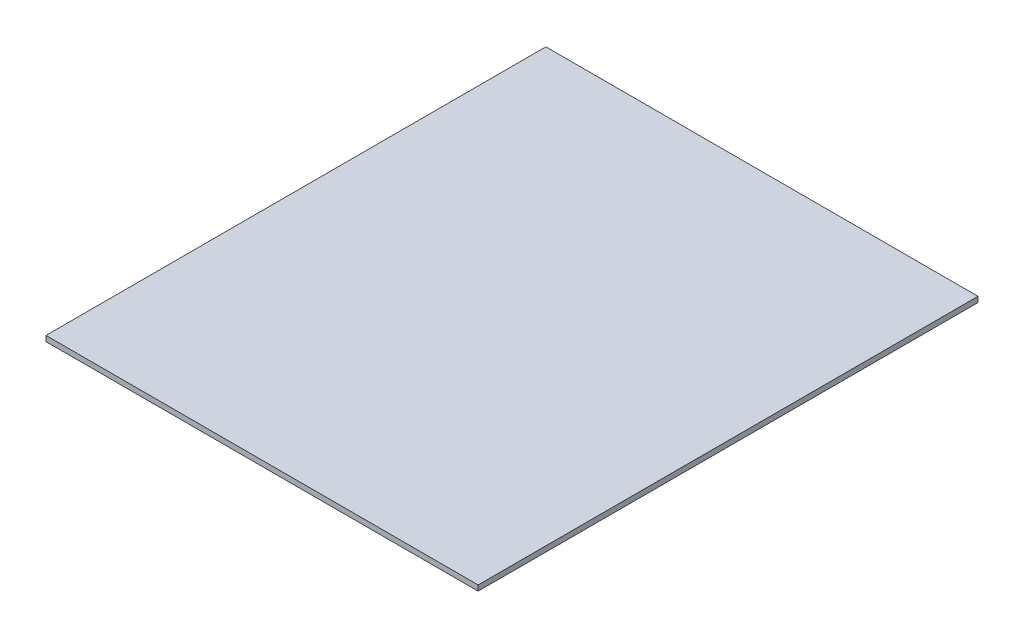
ISO-10303-21;
HEADER;
FILE_DESCRIPTION(('STEP AP214'),'2;1');
FILE_NAME('part.step','',(''),(''),'','','');
FILE_SCHEMA(('AUTOMOTIVE_DESIGN { 1 0 10303 214 1 1 1 1 }'));
ENDSEC;
DATA;
#1=APPLICATION_CONTEXT('core data for automotive mechanical design processes');
#2=APPLICATION_PROTOCOL_DEFINITION('international standard','automotive_design',2000,#1);
#3=PRODUCT_CONTEXT('',#1,'mechanical');
#4=PRODUCT('Part','Part','',(#3));
#5=PRODUCT_RELATED_PRODUCT_CATEGORY('part','',(#4));
#6=PRODUCT_DEFINITION_FORMATION('','',#4);
#7=PRODUCT_DEFINITION_CONTEXT('part definition',#1,'design');
#8=PRODUCT_DEFINITION('design','',#6,#7);
#9=PRODUCT_DEFINITION_SHAPE('','',#8);
#10=(LENGTH_UNIT() NAMED_UNIT(*) SI_UNIT(.MILLI.,.METRE.));
#11=(NAMED_UNIT(*) PLANE_ANGLE_UNIT() SI_UNIT($,.RADIAN.));
#12=(NAMED_UNIT(*) SI_UNIT($,.STERADIAN.) SOLID_ANGLE_UNIT());
#13=UNCERTAINTY_MEASURE_WITH_UNIT(LENGTH_MEASURE(1.E-05),#10,'distance_accuracy_value','');
#14=(GEOMETRIC_REPRESENTATION_CONTEXT(3) GLOBAL_UNCERTAINTY_ASSIGNED_CONTEXT((#13)) GLOBAL_UNIT_ASSIGNED_CONTEXT((#10,
#11,#12)) REPRESENTATION_CONTEXT('',''));
#15=CARTESIAN_POINT('',(0.,0.,0.));
#16=DIRECTION('',(0.,0.,1.));
#17=DIRECTION('',(1.,0.,0.));
#18=AXIS2_PLACEMENT_3D('',#15,#16,#17);
#19=CARTESIAN_POINT('',(253.20625,6.35,292.89375));
#20=DIRECTION('',(-1.,0.,0.));
#21=DIRECTION('',(0.,0.,1.));
#22=AXIS2_PLACEMENT_3D('',#19,#20,#21);
#23=PLANE('',#22);
#24=DIRECTION('',(0.,0.,-1.));
#25=VECTOR('',#24,1.);
#26=CARTESIAN_POINT('',(253.20625,0.,292.89375));
#27=LINE('',#26,#25);
#28=CARTESIAN_POINT('',(253.20625,0.,292.89375));
#29=VERTEX_POINT('',#28);
#30=CARTESIAN_POINT('',(253.20625,0.,-292.89375));
#31=VERTEX_POINT('',#30);
#32=EDGE_CURVE('E111',#29,#31,#27,.T.);
#33=ORIENTED_EDGE('',*,*,#32,.T.);
#34=DIRECTION('',(0.,-1.,0.));
#35=VECTOR('',#34,1.);
#36=CARTESIAN_POINT('',(253.20625,6.35,-292.89375));
#37=LINE('',#36,#35);
#38=CARTESIAN_POINT('',(253.20625,6.35,-292.89375));
#39=VERTEX_POINT('',#38);
#40=EDGE_CURVE('E11',#39,#31,#37,.T.);
#41=ORIENTED_EDGE('',*,*,#40,.F.);
#42=DIRECTION('',(0.,0.,-1.));
#43=VECTOR('',#42,1.);
#44=CARTESIAN_POINT('',(253.20625,6.35,292.89375));
#45=LINE('',#44,#43);
#46=CARTESIAN_POINT('',(253.20625,6.35,292.89375));
#47=VERTEX_POINT('',#46);
#48=EDGE_CURVE('E95',#47,#39,#45,.T.);
#49=ORIENTED_EDGE('',*,*,#48,.F.);
#50=DIRECTION('',(0.,-1.,0.));
#51=VECTOR('',#50,1.);
#52=CARTESIAN_POINT('',(253.20625,6.35,292.89375));
#53=LINE('',#52,#51);
#54=EDGE_CURVE('E107',#47,#29,#53,.T.);
#55=ORIENTED_EDGE('',*,*,#54,.T.);
#56=EDGE_LOOP('',(#33,#41,#49,#55));
#57=FACE_BOUND('',#56,.T.);
#58=ADVANCED_FACE('F43',(#57),#23,.F.);
#59=CARTESIAN_POINT('',(-253.20625,6.35,-292.89375));
#60=DIRECTION('',(0.,0.,1.));
#61=DIRECTION('',(1.,0.,0.));
#62=AXIS2_PLACEMENT_3D('',#59,#60,#61);
#63=PLANE('',#62);
#64=DIRECTION('',(-1.,0.,0.));
#65=VECTOR('',#64,1.);
#66=CARTESIAN_POINT('',(-253.20625,0.,-292.89375));
#67=LINE('',#66,#65);
#68=CARTESIAN_POINT('',(-253.20625,0.,-292.89375));
#69=VERTEX_POINT('',#68);
#70=EDGE_CURVE('E100',#31,#69,#67,.T.);
#71=ORIENTED_EDGE('',*,*,#70,.T.);
#72=DIRECTION('',(0.,-1.,0.));
#73=VECTOR('',#72,1.);
#74=CARTESIAN_POINT('',(-253.20625,6.35,-292.89375));
#75=LINE('',#74,#73);
#76=CARTESIAN_POINT('',(-253.20625,6.35,-292.89375));
#77=VERTEX_POINT('',#76);
#78=EDGE_CURVE('E52',#77,#69,#75,.T.);
#79=ORIENTED_EDGE('',*,*,#78,.F.);
#80=DIRECTION('',(-1.,0.,0.));
#81=VECTOR('',#80,1.);
#82=CARTESIAN_POINT('',(-253.20625,6.35,-292.89375));
#83=LINE('',#82,#81);
#84=EDGE_CURVE('E90',#39,#77,#83,.T.);
#85=ORIENTED_EDGE('',*,*,#84,.F.);
#86=ORIENTED_EDGE('',*,*,#40,.T.);
#87=EDGE_LOOP('',(#71,#79,#85,#86));
#88=FACE_BOUND('',#87,.T.);
#89=ADVANCED_FACE('F99',(#88),#63,.F.);
#90=CARTESIAN_POINT('',(-253.20625,6.35,292.89375));
#91=DIRECTION('',(1.,0.,0.));
#92=DIRECTION('',(0.,0.,-1.));
#93=AXIS2_PLACEMENT_3D('',#90,#91,#92);
#94=PLANE('',#93);
#95=DIRECTION('',(0.,0.,1.));
#96=VECTOR('',#95,1.);
#97=CARTESIAN_POINT('',(-253.20625,0.,292.89375));
#98=LINE('',#97,#96);
#99=CARTESIAN_POINT('',(-253.20625,0.,292.89375));
#100=VERTEX_POINT('',#99);
#101=EDGE_CURVE('E77',#69,#100,#98,.T.);
#102=ORIENTED_EDGE('',*,*,#101,.T.);
#103=DIRECTION('',(0.,-1.,0.));
#104=VECTOR('',#103,1.);
#105=CARTESIAN_POINT('',(-253.20625,6.35,292.89375));
#106=LINE('',#105,#104);
#107=CARTESIAN_POINT('',(-253.20625,6.35,292.89375));
#108=VERTEX_POINT('',#107);
#109=EDGE_CURVE('E102',#108,#100,#106,.T.);
#110=ORIENTED_EDGE('',*,*,#109,.F.);
#111=DIRECTION('',(0.,0.,1.));
#112=VECTOR('',#111,1.);
#113=CARTESIAN_POINT('',(-253.20625,6.35,292.89375));
#114=LINE('',#113,#112);
#115=EDGE_CURVE('E93',#77,#108,#114,.T.);
#116=ORIENTED_EDGE('',*,*,#115,.F.);
#117=ORIENTED_EDGE('',*,*,#78,.T.);
#118=EDGE_LOOP('',(#102,#110,#116,#117));
#119=FACE_BOUND('',#118,.T.);
#120=ADVANCED_FACE('F103',(#119),#94,.F.);
#121=CARTESIAN_POINT('',(-253.20625,6.35,292.89375));
#122=DIRECTION('',(0.,0.,-1.));
#123=DIRECTION('',(-1.,0.,0.));
#124=AXIS2_PLACEMENT_3D('',#121,#122,#123);
#125=PLANE('',#124);
#126=DIRECTION('',(1.,0.,0.));
#127=VECTOR('',#126,1.);
#128=CARTESIAN_POINT('',(-253.20625,0.,292.89375));
#129=LINE('',#128,#127);
#130=EDGE_CURVE('E83',#100,#29,#129,.T.);
#131=ORIENTED_EDGE('',*,*,#130,.T.);
#132=ORIENTED_EDGE('',*,*,#54,.F.);
#133=DIRECTION('',(1.,0.,0.));
#134=VECTOR('',#133,1.);
#135=CARTESIAN_POINT('',(-253.20625,6.35,292.89375));
#136=LINE('',#135,#134);
#137=EDGE_CURVE('E60',#108,#47,#136,.T.);
#138=ORIENTED_EDGE('',*,*,#137,.F.);
#139=ORIENTED_EDGE('',*,*,#109,.T.);
#140=EDGE_LOOP('',(#131,#132,#138,#139));
#141=FACE_BOUND('',#140,.T.);
#142=ADVANCED_FACE('F124',(#141),#125,.F.);
#143=CARTESIAN_POINT('',(0.,6.35,0.));
#144=DIRECTION('',(0.,-1.,0.));
#145=DIRECTION('',(0.,0.,-1.));
#146=AXIS2_PLACEMENT_3D('',#143,#144,#145);
#147=PLANE('',#146);
#148=ORIENTED_EDGE('',*,*,#48,.T.);
#149=ORIENTED_EDGE('',*,*,#84,.T.);
#150=ORIENTED_EDGE('',*,*,#115,.T.);
#151=ORIENTED_EDGE('',*,*,#137,.T.);
#152=EDGE_LOOP('',(#148,#149,#150,#151));
#153=FACE_BOUND('',#152,.T.);
#154=ADVANCED_FACE('F91',(#153),#147,.F.);
#155=CARTESIAN_POINT('',(0.,0.,0.));
#156=DIRECTION('',(0.,-1.,0.));
#157=DIRECTION('',(0.,0.,-1.));
#158=AXIS2_PLACEMENT_3D('',#155,#156,#157);
#159=PLANE('',#158);
#160=ORIENTED_EDGE('',*,*,#32,.F.);
#161=ORIENTED_EDGE('',*,*,#130,.F.);
#162=ORIENTED_EDGE('',*,*,#101,.F.);
#163=ORIENTED_EDGE('',*,*,#70,.F.);
#164=EDGE_LOOP('',(#160,#161,#162,#163));
#165=FACE_BOUND('',#164,.T.);
#166=ADVANCED_FACE('F127',(#165),#159,.T.);
#167=CLOSED_SHELL('',(#58,#89,#120,#142,#154,#166));
#168=MANIFOLD_SOLID_BREP('B2',#167);
#169=ADVANCED_BREP_SHAPE_REPRESENTATION('',(#18,#168),#14);
#170=SHAPE_DEFINITION_REPRESENTATION(#9,#169);
ENDSEC;
END-ISO-10303-21;
